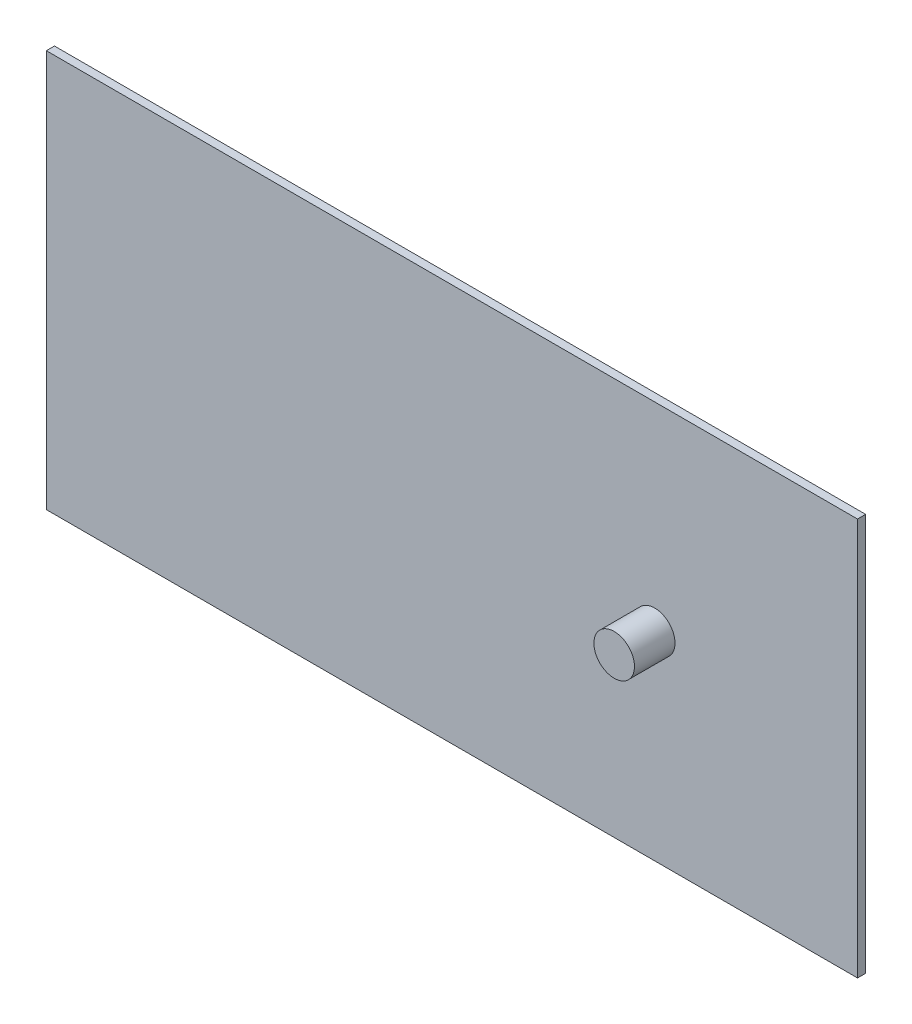
ISO-10303-21;
HEADER;
FILE_DESCRIPTION(('STEP AP214'),'2;1');
FILE_NAME('part.step','',(''),(''),'','','');
FILE_SCHEMA(('AUTOMOTIVE_DESIGN { 1 0 10303 214 1 1 1 1 }'));
ENDSEC;
DATA;
#1=APPLICATION_CONTEXT('core data for automotive mechanical design processes');
#2=APPLICATION_PROTOCOL_DEFINITION('international standard','automotive_design',2000,#1);
#3=PRODUCT_CONTEXT('',#1,'mechanical');
#4=PRODUCT('Part','Part','',(#3));
#5=PRODUCT_RELATED_PRODUCT_CATEGORY('part','',(#4));
#6=PRODUCT_DEFINITION_FORMATION('','',#4);
#7=PRODUCT_DEFINITION_CONTEXT('part definition',#1,'design');
#8=PRODUCT_DEFINITION('design','',#6,#7);
#9=PRODUCT_DEFINITION_SHAPE('','',#8);
#10=(LENGTH_UNIT() NAMED_UNIT(*) SI_UNIT(.MILLI.,.METRE.));
#11=(NAMED_UNIT(*) PLANE_ANGLE_UNIT() SI_UNIT($,.RADIAN.));
#12=(NAMED_UNIT(*) SI_UNIT($,.STERADIAN.) SOLID_ANGLE_UNIT());
#13=UNCERTAINTY_MEASURE_WITH_UNIT(LENGTH_MEASURE(1.E-05),#10,'distance_accuracy_value','');
#14=(GEOMETRIC_REPRESENTATION_CONTEXT(3) GLOBAL_UNCERTAINTY_ASSIGNED_CONTEXT((#13)) GLOBAL_UNIT_ASSIGNED_CONTEXT((#10,
#11,#12)) REPRESENTATION_CONTEXT('',''));
#15=CARTESIAN_POINT('',(0.,0.,0.));
#16=DIRECTION('',(0.,0.,1.));
#17=DIRECTION('',(1.,0.,0.));
#18=AXIS2_PLACEMENT_3D('',#15,#16,#17);
#19=CARTESIAN_POINT('',(-100.,49.,2.));
#20=DIRECTION('',(1.,0.,0.));
#21=DIRECTION('',(0.,1.,0.));
#22=AXIS2_PLACEMENT_3D('',#19,#20,#21);
#23=PLANE('',#22);
#24=DIRECTION('',(0.,-1.,0.));
#25=VECTOR('',#24,1.);
#26=CARTESIAN_POINT('',(-100.,49.,0.));
#27=LINE('',#26,#25);
#28=CARTESIAN_POINT('',(-100.,49.,0.));
#29=VERTEX_POINT('',#28);
#30=CARTESIAN_POINT('',(-100.,-49.0000000000001,0.));
#31=VERTEX_POINT('',#30);
#32=EDGE_CURVE('E114',#29,#31,#27,.T.);
#33=ORIENTED_EDGE('',*,*,#32,.T.);
#34=DIRECTION('',(0.,0.,-1.));
#35=VECTOR('',#34,1.);
#36=CARTESIAN_POINT('',(-100.,-49.0000000000001,2.));
#37=LINE('',#36,#35);
#38=CARTESIAN_POINT('',(-100.,-49.0000000000001,2.));
#39=VERTEX_POINT('',#38);
#40=EDGE_CURVE('E52',#39,#31,#37,.T.);
#41=ORIENTED_EDGE('',*,*,#40,.F.);
#42=DIRECTION('',(0.,-1.,0.));
#43=VECTOR('',#42,1.);
#44=CARTESIAN_POINT('',(-100.,49.,2.));
#45=LINE('',#44,#43);
#46=CARTESIAN_POINT('',(-100.,49.,2.));
#47=VERTEX_POINT('',#46);
#48=EDGE_CURVE('E96',#47,#39,#45,.T.);
#49=ORIENTED_EDGE('',*,*,#48,.F.);
#50=DIRECTION('',(0.,0.,-1.));
#51=VECTOR('',#50,1.);
#52=CARTESIAN_POINT('',(-100.,49.,2.));
#53=LINE('',#52,#51);
#54=EDGE_CURVE('E110',#47,#29,#53,.T.);
#55=ORIENTED_EDGE('',*,*,#54,.T.);
#56=EDGE_LOOP('',(#33,#41,#49,#55));
#57=FACE_BOUND('',#56,.T.);
#58=ADVANCED_FACE('F43',(#57),#23,.F.);
#59=CARTESIAN_POINT('',(100.,-49.,2.));
#60=DIRECTION('',(0.,1.,0.));
#61=DIRECTION('',(-1.,0.,0.));
#62=AXIS2_PLACEMENT_3D('',#59,#60,#61);
#63=PLANE('',#62);
#64=DIRECTION('',(1.,0.,0.));
#65=VECTOR('',#64,1.);
#66=CARTESIAN_POINT('',(100.,-49.,0.));
#67=LINE('',#66,#65);
#68=CARTESIAN_POINT('',(100.,-49.,0.));
#69=VERTEX_POINT('',#68);
#70=EDGE_CURVE('E102',#31,#69,#67,.T.);
#71=ORIENTED_EDGE('',*,*,#70,.T.);
#72=DIRECTION('',(0.,0.,-1.));
#73=VECTOR('',#72,1.);
#74=CARTESIAN_POINT('',(100.,-49.,2.));
#75=LINE('',#74,#73);
#76=CARTESIAN_POINT('',(100.,-49.,2.));
#77=VERTEX_POINT('',#76);
#78=EDGE_CURVE('E100',#77,#69,#75,.T.);
#79=ORIENTED_EDGE('',*,*,#78,.F.);
#80=DIRECTION('',(1.,0.,0.));
#81=VECTOR('',#80,1.);
#82=CARTESIAN_POINT('',(100.,-49.,2.));
#83=LINE('',#82,#81);
#84=EDGE_CURVE('E91',#39,#77,#83,.T.);
#85=ORIENTED_EDGE('',*,*,#84,.F.);
#86=ORIENTED_EDGE('',*,*,#40,.T.);
#87=EDGE_LOOP('',(#71,#79,#85,#86));
#88=FACE_BOUND('',#87,.T.);
#89=ADVANCED_FACE('F101',(#88),#63,.F.);
#90=CARTESIAN_POINT('',(100.,49.,2.));
#91=DIRECTION('',(-1.,0.,0.));
#92=DIRECTION('',(0.,-1.,0.));
#93=AXIS2_PLACEMENT_3D('',#90,#91,#92);
#94=PLANE('',#93);
#95=DIRECTION('',(0.,1.,0.));
#96=VECTOR('',#95,1.);
#97=CARTESIAN_POINT('',(100.,49.,0.));
#98=LINE('',#97,#96);
#99=CARTESIAN_POINT('',(100.,49.,0.));
#100=VERTEX_POINT('',#99);
#101=EDGE_CURVE('E77',#69,#100,#98,.T.);
#102=ORIENTED_EDGE('',*,*,#101,.T.);
#103=DIRECTION('',(0.,0.,-1.));
#104=VECTOR('',#103,1.);
#105=CARTESIAN_POINT('',(100.,49.,2.));
#106=LINE('',#105,#104);
#107=CARTESIAN_POINT('',(100.,49.,2.));
#108=VERTEX_POINT('',#107);
#109=EDGE_CURVE('E104',#108,#100,#106,.T.);
#110=ORIENTED_EDGE('',*,*,#109,.F.);
#111=DIRECTION('',(0.,1.,0.));
#112=VECTOR('',#111,1.);
#113=CARTESIAN_POINT('',(100.,49.,2.));
#114=LINE('',#113,#112);
#115=EDGE_CURVE('E94',#77,#108,#114,.T.);
#116=ORIENTED_EDGE('',*,*,#115,.F.);
#117=ORIENTED_EDGE('',*,*,#78,.T.);
#118=EDGE_LOOP('',(#102,#110,#116,#117));
#119=FACE_BOUND('',#118,.T.);
#120=ADVANCED_FACE('F106',(#119),#94,.F.);
#121=CARTESIAN_POINT('',(100.,49.,2.));
#122=DIRECTION('',(0.,-1.,0.));
#123=DIRECTION('',(1.,0.,0.));
#124=AXIS2_PLACEMENT_3D('',#121,#122,#123);
#125=PLANE('',#124);
#126=DIRECTION('',(-1.,0.,0.));
#127=VECTOR('',#126,1.);
#128=CARTESIAN_POINT('',(100.,49.,0.));
#129=LINE('',#128,#127);
#130=EDGE_CURVE('E83',#100,#29,#129,.T.);
#131=ORIENTED_EDGE('',*,*,#130,.T.);
#132=ORIENTED_EDGE('',*,*,#54,.F.);
#133=DIRECTION('',(-1.,0.,0.));
#134=VECTOR('',#133,1.);
#135=CARTESIAN_POINT('',(100.,49.,2.));
#136=LINE('',#135,#134);
#137=EDGE_CURVE('E60',#108,#47,#136,.T.);
#138=ORIENTED_EDGE('',*,*,#137,.F.);
#139=ORIENTED_EDGE('',*,*,#109,.T.);
#140=EDGE_LOOP('',(#131,#132,#138,#139));
#141=FACE_BOUND('',#140,.T.);
#142=ADVANCED_FACE('F144',(#141),#125,.F.);
#143=CARTESIAN_POINT('',(0.,0.,2.));
#144=DIRECTION('',(0.,0.,-1.));
#145=DIRECTION('',(-1.,0.,0.));
#146=AXIS2_PLACEMENT_3D('',#143,#144,#145);
#147=PLANE('',#146);
#148=CARTESIAN_POINT('',(50.,0.,2.));
#149=DIRECTION('',(0.,0.,-1.));
#150=DIRECTION('',(-1.,0.,0.));
#151=AXIS2_PLACEMENT_3D('',#148,#149,#150);
#152=CIRCLE('',#151,5.);
#153=CARTESIAN_POINT('',(45.,0.,2.));
#154=VERTEX_POINT('',#153);
#155=EDGE_CURVE('E11',#154,#154,#152,.F.);
#156=ORIENTED_EDGE('',*,*,#155,.F.);
#157=EDGE_LOOP('',(#156));
#158=FACE_BOUND('',#157,.T.);
#159=ORIENTED_EDGE('',*,*,#48,.T.);
#160=ORIENTED_EDGE('',*,*,#84,.T.);
#161=ORIENTED_EDGE('',*,*,#115,.T.);
#162=ORIENTED_EDGE('',*,*,#137,.T.);
#163=EDGE_LOOP('',(#159,#160,#161,#162));
#164=FACE_BOUND('',#163,.T.);
#165=ADVANCED_FACE('F92',(#158,#164),#147,.F.);
#166=CARTESIAN_POINT('',(0.,0.,0.));
#167=DIRECTION('',(0.,0.,-1.));
#168=DIRECTION('',(-1.,0.,0.));
#169=AXIS2_PLACEMENT_3D('',#166,#167,#168);
#170=PLANE('',#169);
#171=ORIENTED_EDGE('',*,*,#32,.F.);
#172=ORIENTED_EDGE('',*,*,#130,.F.);
#173=ORIENTED_EDGE('',*,*,#101,.F.);
#174=ORIENTED_EDGE('',*,*,#70,.F.);
#175=EDGE_LOOP('',(#171,#172,#173,#174));
#176=FACE_BOUND('',#175,.T.);
#177=ADVANCED_FACE('F132',(#176),#170,.T.);
#178=CARTESIAN_POINT('',(50.,0.,12.));
#179=DIRECTION('',(0.,0.,-1.));
#180=DIRECTION('',(-1.,0.,0.));
#181=AXIS2_PLACEMENT_3D('',#178,#179,#180);
#182=CYLINDRICAL_SURFACE('',#181,5.);
#183=CARTESIAN_POINT('',(50.,0.,12.));
#184=DIRECTION('',(0.,0.,1.));
#185=DIRECTION('',(1.,0.,0.));
#186=AXIS2_PLACEMENT_3D('',#183,#184,#185);
#187=CIRCLE('',#186,5.);
#188=CARTESIAN_POINT('',(55.,0.,12.));
#189=VERTEX_POINT('',#188);
#190=EDGE_CURVE('E118',#189,#189,#187,.T.);
#191=ORIENTED_EDGE('',*,*,#190,.F.);
#192=EDGE_LOOP('',(#191));
#193=FACE_BOUND('',#192,.T.);
#194=ORIENTED_EDGE('',*,*,#155,.T.);
#195=EDGE_LOOP('',(#194));
#196=FACE_BOUND('',#195,.T.);
#197=ADVANCED_FACE('F134',(#193,#196),#182,.T.);
#198=CARTESIAN_POINT('',(50.,0.,12.));
#199=DIRECTION('',(0.,0.,1.));
#200=DIRECTION('',(1.,0.,0.));
#201=AXIS2_PLACEMENT_3D('',#198,#199,#200);
#202=PLANE('',#201);
#203=ORIENTED_EDGE('',*,*,#190,.T.);
#204=EDGE_LOOP('',(#203));
#205=FACE_BOUND('',#204,.T.);
#206=ADVANCED_FACE('F140',(#205),#202,.T.);
#207=CLOSED_SHELL('',(#58,#89,#120,#142,#165,#177,#197,#206));
#208=MANIFOLD_SOLID_BREP('B2',#207);
#209=ADVANCED_BREP_SHAPE_REPRESENTATION('',(#18,#208),#14);
#210=SHAPE_DEFINITION_REPRESENTATION(#9,#209);
ENDSEC;
END-ISO-10303-21;
